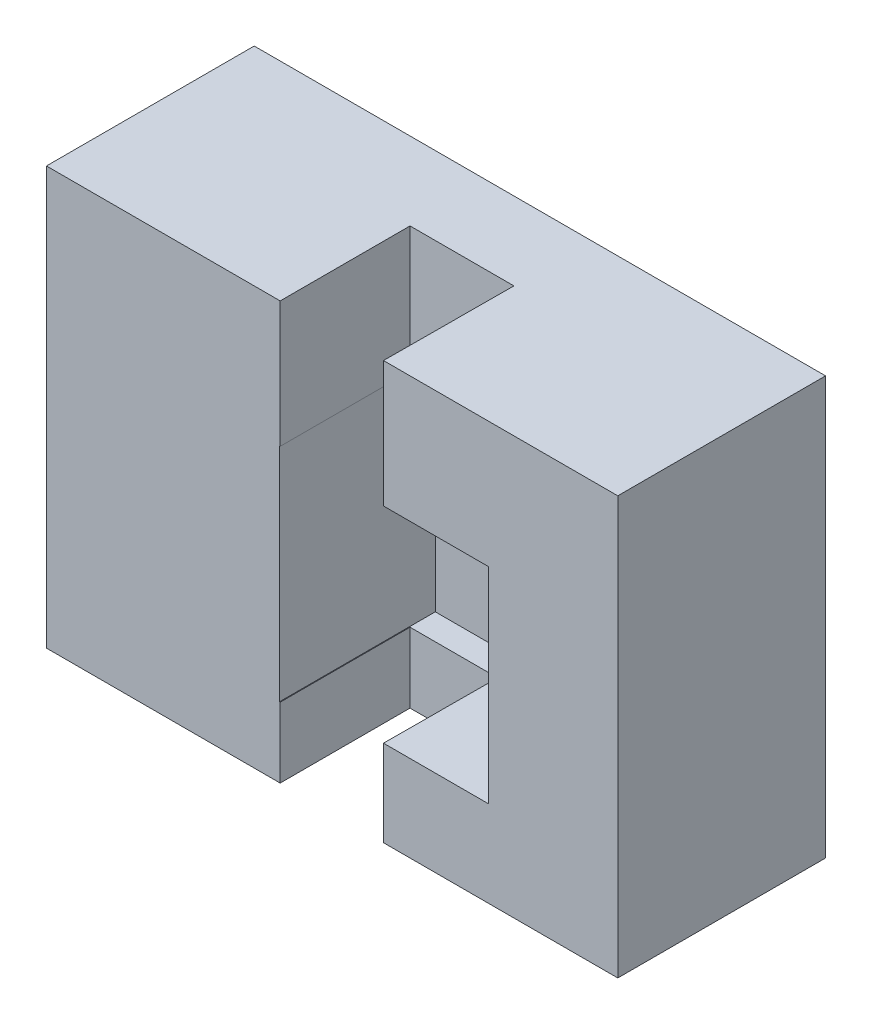
ISO-10303-21;
HEADER;
FILE_DESCRIPTION(('STEP AP214'),'2;1');
FILE_NAME('part.step','',(''),(''),'','','');
FILE_SCHEMA(('AUTOMOTIVE_DESIGN { 1 0 10303 214 1 1 1 1 }'));
ENDSEC;
DATA;
#1=APPLICATION_CONTEXT('core data for automotive mechanical design processes');
#2=APPLICATION_PROTOCOL_DEFINITION('international standard','automotive_design',2000,#1);
#3=PRODUCT_CONTEXT('',#1,'mechanical');
#4=PRODUCT('Part','Part','',(#3));
#5=PRODUCT_RELATED_PRODUCT_CATEGORY('part','',(#4));
#6=PRODUCT_DEFINITION_FORMATION('','',#4);
#7=PRODUCT_DEFINITION_CONTEXT('part definition',#1,'design');
#8=PRODUCT_DEFINITION('design','',#6,#7);
#9=PRODUCT_DEFINITION_SHAPE('','',#8);
#10=(LENGTH_UNIT() NAMED_UNIT(*) SI_UNIT(.MILLI.,.METRE.));
#11=(NAMED_UNIT(*) PLANE_ANGLE_UNIT() SI_UNIT($,.RADIAN.));
#12=(NAMED_UNIT(*) SI_UNIT($,.STERADIAN.) SOLID_ANGLE_UNIT());
#13=UNCERTAINTY_MEASURE_WITH_UNIT(LENGTH_MEASURE(1.E-05),#10,'distance_accuracy_value','');
#14=(GEOMETRIC_REPRESENTATION_CONTEXT(3) GLOBAL_UNCERTAINTY_ASSIGNED_CONTEXT((#13)) GLOBAL_UNIT_ASSIGNED_CONTEXT((#10,
#11,#12)) REPRESENTATION_CONTEXT('',''));
#15=CARTESIAN_POINT('',(0.,0.,0.));
#16=DIRECTION('',(0.,0.,1.));
#17=DIRECTION('',(1.,0.,0.));
#18=AXIS2_PLACEMENT_3D('',#15,#16,#17);
#19=CARTESIAN_POINT('',(0.,0.,40.));
#20=DIRECTION('',(0.,0.,1.));
#21=DIRECTION('',(1.,0.,0.));
#22=AXIS2_PLACEMENT_3D('',#19,#20,#21);
#23=PLANE('',#22);
#24=DIRECTION('',(0.,1.,0.));
#25=VECTOR('',#24,1.);
#26=CARTESIAN_POINT('',(-9.99999999999963,-40.2,40.));
#27=LINE('',#26,#25);
#28=CARTESIAN_POINT('',(-9.99999999999963,15.947775895512,40.));
#29=VERTEX_POINT('',#28);
#30=CARTESIAN_POINT('',(-9.99999999999963,40.2,40.));
#31=VERTEX_POINT('',#30);
#32=EDGE_CURVE('E238',#29,#31,#27,.T.);
#33=ORIENTED_EDGE('',*,*,#32,.T.);
#34=DIRECTION('',(-1.,0.,0.));
#35=VECTOR('',#34,1.);
#36=CARTESIAN_POINT('',(-55.,40.2,40.));
#37=LINE('',#36,#35);
#38=CARTESIAN_POINT('',(-55.,40.2,40.));
#39=VERTEX_POINT('',#38);
#40=EDGE_CURVE('E196',#31,#39,#37,.T.);
#41=ORIENTED_EDGE('',*,*,#40,.T.);
#42=DIRECTION('',(0.,-1.,0.));
#43=VECTOR('',#42,1.);
#44=CARTESIAN_POINT('',(-55.,40.2,40.));
#45=LINE('',#44,#43);
#46=CARTESIAN_POINT('',(-55.,-40.2,40.));
#47=VERTEX_POINT('',#46);
#48=EDGE_CURVE('E186',#39,#47,#45,.T.);
#49=ORIENTED_EDGE('',*,*,#48,.T.);
#50=DIRECTION('',(1.,0.,0.));
#51=VECTOR('',#50,1.);
#52=CARTESIAN_POINT('',(-55.,-40.2,40.));
#53=LINE('',#52,#51);
#54=CARTESIAN_POINT('',(-9.99999999999963,-40.2,40.));
#55=VERTEX_POINT('',#54);
#56=EDGE_CURVE('E185',#47,#55,#53,.T.);
#57=ORIENTED_EDGE('',*,*,#56,.T.);
#58=CARTESIAN_POINT('',(-9.99999999999963,-26.7104778254286,40.));
#59=VERTEX_POINT('',#58);
#60=EDGE_CURVE('E241',#55,#59,#27,.T.);
#61=ORIENTED_EDGE('',*,*,#60,.T.);
#62=DIRECTION('',(1.,0.,0.));
#63=VECTOR('',#62,1.);
#64=CARTESIAN_POINT('',(-10.1339162472556,-26.7104778254286,40.));
#65=LINE('',#64,#63);
#66=CARTESIAN_POINT('',(-10.1339162472556,-26.7104778254286,40.));
#67=VERTEX_POINT('',#66);
#68=EDGE_CURVE('E168',#67,#59,#65,.T.);
#69=ORIENTED_EDGE('',*,*,#68,.F.);
#70=DIRECTION('',(0.,-1.,0.));
#71=VECTOR('',#70,1.);
#72=CARTESIAN_POINT('',(-10.1339162472556,15.947775895512,40.));
#73=LINE('',#72,#71);
#74=CARTESIAN_POINT('',(-10.1339162472556,15.947775895512,40.));
#75=VERTEX_POINT('',#74);
#76=EDGE_CURVE('E282',#75,#67,#73,.T.);
#77=ORIENTED_EDGE('',*,*,#76,.F.);
#78=DIRECTION('',(-1.,0.,0.));
#79=VECTOR('',#78,1.);
#80=CARTESIAN_POINT('',(30.0976078726265,15.947775895512,40.));
#81=LINE('',#80,#79);
#82=EDGE_CURVE('E279',#29,#75,#81,.T.);
#83=ORIENTED_EDGE('',*,*,#82,.F.);
#84=EDGE_LOOP('',(#33,#41,#49,#57,#61,#69,#77,#83));
#85=FACE_BOUND('',#84,.T.);
#86=ADVANCED_FACE('F33',(#85),#23,.T.);
#87=CARTESIAN_POINT('',(-55.,40.2,40.));
#88=DIRECTION('',(1.,0.,0.));
#89=DIRECTION('',(0.,1.,0.));
#90=AXIS2_PLACEMENT_3D('',#87,#88,#89);
#91=PLANE('',#90);
#92=DIRECTION('',(0.,-1.,0.));
#93=VECTOR('',#92,1.);
#94=CARTESIAN_POINT('',(-55.,40.2,0.));
#95=LINE('',#94,#93);
#96=CARTESIAN_POINT('',(-55.,40.2,0.));
#97=VERTEX_POINT('',#96);
#98=CARTESIAN_POINT('',(-55.,-40.2,0.));
#99=VERTEX_POINT('',#98);
#100=EDGE_CURVE('E201',#97,#99,#95,.T.);
#101=ORIENTED_EDGE('',*,*,#100,.T.);
#102=DIRECTION('',(0.,0.,-1.));
#103=VECTOR('',#102,1.);
#104=CARTESIAN_POINT('',(-55.,-40.2,40.));
#105=LINE('',#104,#103);
#106=EDGE_CURVE('E216',#47,#99,#105,.T.);
#107=ORIENTED_EDGE('',*,*,#106,.F.);
#108=ORIENTED_EDGE('',*,*,#48,.F.);
#109=DIRECTION('',(0.,0.,-1.));
#110=VECTOR('',#109,1.);
#111=CARTESIAN_POINT('',(-55.,40.2,40.));
#112=LINE('',#111,#110);
#113=EDGE_CURVE('E200',#39,#97,#112,.T.);
#114=ORIENTED_EDGE('',*,*,#113,.T.);
#115=EDGE_LOOP('',(#101,#107,#108,#114));
#116=FACE_BOUND('',#115,.T.);
#117=ADVANCED_FACE('F35',(#116),#91,.F.);
#118=CARTESIAN_POINT('',(-55.,-40.2,40.));
#119=DIRECTION('',(0.,1.,0.));
#120=DIRECTION('',(0.,0.,1.));
#121=AXIS2_PLACEMENT_3D('',#118,#119,#120);
#122=PLANE('',#121);
#123=DIRECTION('',(-1.,0.,0.));
#124=VECTOR('',#123,1.);
#125=CARTESIAN_POINT('',(10.0000000000004,-40.2,15.0000000000003));
#126=LINE('',#125,#124);
#127=CARTESIAN_POINT('',(10.0000000000004,-40.2,15.0000000000003));
#128=VERTEX_POINT('',#127);
#129=CARTESIAN_POINT('',(-9.99999999999962,-40.2,15.0000000000003));
#130=VERTEX_POINT('',#129);
#131=EDGE_CURVE('E178',#128,#130,#126,.T.);
#132=ORIENTED_EDGE('',*,*,#131,.T.);
#133=DIRECTION('',(0.,0.,1.));
#134=VECTOR('',#133,1.);
#135=CARTESIAN_POINT('',(-9.99999999999962,-40.2,15.0000000000003));
#136=LINE('',#135,#134);
#137=EDGE_CURVE('E246',#130,#55,#136,.T.);
#138=ORIENTED_EDGE('',*,*,#137,.T.);
#139=ORIENTED_EDGE('',*,*,#56,.F.);
#140=ORIENTED_EDGE('',*,*,#106,.T.);
#141=DIRECTION('',(1.,0.,0.));
#142=VECTOR('',#141,1.);
#143=CARTESIAN_POINT('',(-55.,-40.2,0.));
#144=LINE('',#143,#142);
#145=CARTESIAN_POINT('',(55.,-40.2,0.));
#146=VERTEX_POINT('',#145);
#147=EDGE_CURVE('E204',#99,#146,#144,.T.);
#148=ORIENTED_EDGE('',*,*,#147,.T.);
#149=DIRECTION('',(0.,0.,-1.));
#150=VECTOR('',#149,1.);
#151=CARTESIAN_POINT('',(55.,-40.2,40.));
#152=LINE('',#151,#150);
#153=CARTESIAN_POINT('',(55.,-40.2,40.));
#154=VERTEX_POINT('',#153);
#155=EDGE_CURVE('E183',#154,#146,#152,.T.);
#156=ORIENTED_EDGE('',*,*,#155,.F.);
#157=CARTESIAN_POINT('',(9.88902334372366,-40.2,40.));
#158=VERTEX_POINT('',#157);
#159=EDGE_CURVE('E161',#158,#154,#53,.T.);
#160=ORIENTED_EDGE('',*,*,#159,.F.);
#161=DIRECTION('',(0.00443902251512886,0.,-0.999990147491019));
#162=VECTOR('',#161,1.);
#163=CARTESIAN_POINT('',(9.88902334372366,-40.2,40.));
#164=LINE('',#163,#162);
#165=EDGE_CURVE('E171',#158,#128,#164,.T.);
#166=ORIENTED_EDGE('',*,*,#165,.T.);
#167=EDGE_LOOP('',(#132,#138,#139,#140,#148,#156,#160,#166));
#168=FACE_BOUND('',#167,.T.);
#169=ADVANCED_FACE('F181',(#168),#122,.F.);
#170=CARTESIAN_POINT('',(55.,40.2,40.));
#171=DIRECTION('',(-1.,0.,0.));
#172=DIRECTION('',(0.,0.,1.));
#173=AXIS2_PLACEMENT_3D('',#170,#171,#172);
#174=PLANE('',#173);
#175=DIRECTION('',(0.,1.,0.));
#176=VECTOR('',#175,1.);
#177=CARTESIAN_POINT('',(55.,40.2,0.));
#178=LINE('',#177,#176);
#179=CARTESIAN_POINT('',(55.,40.2,0.));
#180=VERTEX_POINT('',#179);
#181=EDGE_CURVE('E207',#146,#180,#178,.T.);
#182=ORIENTED_EDGE('',*,*,#181,.T.);
#183=DIRECTION('',(0.,0.,-1.));
#184=VECTOR('',#183,1.);
#185=CARTESIAN_POINT('',(55.,40.2,40.));
#186=LINE('',#185,#184);
#187=CARTESIAN_POINT('',(55.,40.2,40.));
#188=VERTEX_POINT('',#187);
#189=EDGE_CURVE('E212',#188,#180,#186,.T.);
#190=ORIENTED_EDGE('',*,*,#189,.F.);
#191=DIRECTION('',(0.,1.,0.));
#192=VECTOR('',#191,1.);
#193=CARTESIAN_POINT('',(55.,40.2,40.));
#194=LINE('',#193,#192);
#195=EDGE_CURVE('E189',#154,#188,#194,.T.);
#196=ORIENTED_EDGE('',*,*,#195,.F.);
#197=ORIENTED_EDGE('',*,*,#155,.T.);
#198=EDGE_LOOP('',(#182,#190,#196,#197));
#199=FACE_BOUND('',#198,.T.);
#200=ADVANCED_FACE('F372',(#199),#174,.F.);
#201=CARTESIAN_POINT('',(-55.,40.2,40.));
#202=DIRECTION('',(0.,-1.,0.));
#203=DIRECTION('',(0.,0.,-1.));
#204=AXIS2_PLACEMENT_3D('',#201,#202,#203);
#205=PLANE('',#204);
#206=ORIENTED_EDGE('',*,*,#40,.F.);
#207=DIRECTION('',(0.,0.,1.));
#208=VECTOR('',#207,1.);
#209=CARTESIAN_POINT('',(-9.99999999999962,40.2,15.0000000000003));
#210=LINE('',#209,#208);
#211=CARTESIAN_POINT('',(-9.99999999999962,40.2,15.0000000000003));
#212=VERTEX_POINT('',#211);
#213=EDGE_CURVE('E179',#212,#31,#210,.T.);
#214=ORIENTED_EDGE('',*,*,#213,.F.);
#215=DIRECTION('',(-1.,0.,0.));
#216=VECTOR('',#215,1.);
#217=CARTESIAN_POINT('',(10.0000000000004,40.2,15.0000000000003));
#218=LINE('',#217,#216);
#219=CARTESIAN_POINT('',(10.0000000000004,40.2,15.0000000000003));
#220=VERTEX_POINT('',#219);
#221=EDGE_CURVE('E232',#220,#212,#218,.T.);
#222=ORIENTED_EDGE('',*,*,#221,.F.);
#223=DIRECTION('',(0.00443902251512886,0.,-0.999990147491019));
#224=VECTOR('',#223,1.);
#225=CARTESIAN_POINT('',(9.88902334372366,40.2,40.));
#226=LINE('',#225,#224);
#227=CARTESIAN_POINT('',(9.88902334372366,40.2,40.));
#228=VERTEX_POINT('',#227);
#229=EDGE_CURVE('E308',#228,#220,#226,.T.);
#230=ORIENTED_EDGE('',*,*,#229,.F.);
#231=EDGE_CURVE('E197',#188,#228,#37,.T.);
#232=ORIENTED_EDGE('',*,*,#231,.F.);
#233=ORIENTED_EDGE('',*,*,#189,.T.);
#234=DIRECTION('',(-1.,0.,0.));
#235=VECTOR('',#234,1.);
#236=CARTESIAN_POINT('',(-55.,40.2,0.));
#237=LINE('',#236,#235);
#238=EDGE_CURVE('E191',#180,#97,#237,.T.);
#239=ORIENTED_EDGE('',*,*,#238,.T.);
#240=ORIENTED_EDGE('',*,*,#113,.F.);
#241=EDGE_LOOP('',(#206,#214,#222,#230,#232,#233,#239,#240));
#242=FACE_BOUND('',#241,.T.);
#243=ADVANCED_FACE('F311',(#242),#205,.F.);
#244=DIRECTION('',(0.,1.,0.));
#245=VECTOR('',#244,1.);
#246=CARTESIAN_POINT('',(9.88902334372366,-26.7104778254286,40.));
#247=LINE('',#246,#245);
#248=CARTESIAN_POINT('',(9.88902334372366,-23.5994291863939,40.));
#249=VERTEX_POINT('',#248);
#250=EDGE_CURVE('E157',#158,#249,#247,.T.);
#251=ORIENTED_EDGE('',*,*,#250,.F.);
#252=ORIENTED_EDGE('',*,*,#159,.T.);
#253=ORIENTED_EDGE('',*,*,#195,.T.);
#254=ORIENTED_EDGE('',*,*,#231,.T.);
#255=DIRECTION('',(0.,1.,0.));
#256=VECTOR('',#255,1.);
#257=CARTESIAN_POINT('',(9.88902334372366,-40.2,40.));
#258=LINE('',#257,#256);
#259=CARTESIAN_POINT('',(9.88902334372366,15.947775895512,40.));
#260=VERTEX_POINT('',#259);
#261=EDGE_CURVE('E244',#260,#228,#258,.T.);
#262=ORIENTED_EDGE('',*,*,#261,.F.);
#263=CARTESIAN_POINT('',(30.0976078726265,15.947775895512,40.));
#264=VERTEX_POINT('',#263);
#265=EDGE_CURVE('E280',#264,#260,#81,.T.);
#266=ORIENTED_EDGE('',*,*,#265,.F.);
#267=DIRECTION('',(0.,1.,0.));
#268=VECTOR('',#267,1.);
#269=CARTESIAN_POINT('',(30.0976078726265,-23.5994291863939,40.));
#270=LINE('',#269,#268);
#271=CARTESIAN_POINT('',(30.0976078726265,-23.5994291863939,40.));
#272=VERTEX_POINT('',#271);
#273=EDGE_CURVE('E258',#272,#264,#270,.T.);
#274=ORIENTED_EDGE('',*,*,#273,.F.);
#275=DIRECTION('',(1.,0.,0.));
#276=VECTOR('',#275,1.);
#277=CARTESIAN_POINT('',(9.88902334372366,-23.5994291863939,40.));
#278=LINE('',#277,#276);
#279=EDGE_CURVE('E165',#249,#272,#278,.T.);
#280=ORIENTED_EDGE('',*,*,#279,.F.);
#281=EDGE_LOOP('',(#251,#252,#253,#254,#262,#266,#274,#280));
#282=FACE_BOUND('',#281,.T.);
#283=ADVANCED_FACE('F159',(#282),#23,.T.);
#284=CARTESIAN_POINT('',(0.,0.,0.));
#285=DIRECTION('',(0.,0.,1.));
#286=DIRECTION('',(1.,0.,0.));
#287=AXIS2_PLACEMENT_3D('',#284,#285,#286);
#288=PLANE('',#287);
#289=ORIENTED_EDGE('',*,*,#100,.F.);
#290=ORIENTED_EDGE('',*,*,#238,.F.);
#291=ORIENTED_EDGE('',*,*,#181,.F.);
#292=ORIENTED_EDGE('',*,*,#147,.F.);
#293=EDGE_LOOP('',(#289,#290,#291,#292));
#294=FACE_BOUND('',#293,.T.);
#295=ADVANCED_FACE('F366',(#294),#288,.F.);
#296=CARTESIAN_POINT('',(30.0976078726265,-23.5994291863939,10.));
#297=DIRECTION('',(1.,0.,0.));
#298=DIRECTION('',(0.,0.,-1.));
#299=AXIS2_PLACEMENT_3D('',#296,#297,#298);
#300=PLANE('',#299);
#301=ORIENTED_EDGE('',*,*,#273,.T.);
#302=DIRECTION('',(0.,0.,1.));
#303=VECTOR('',#302,1.);
#304=CARTESIAN_POINT('',(30.0976078726265,15.947775895512,10.));
#305=LINE('',#304,#303);
#306=CARTESIAN_POINT('',(30.0976078726265,15.947775895512,10.));
#307=VERTEX_POINT('',#306);
#308=EDGE_CURVE('E277',#307,#264,#305,.T.);
#309=ORIENTED_EDGE('',*,*,#308,.F.);
#310=DIRECTION('',(0.,1.,0.));
#311=VECTOR('',#310,1.);
#312=CARTESIAN_POINT('',(30.0976078726265,-23.5994291863939,10.));
#313=LINE('',#312,#311);
#314=CARTESIAN_POINT('',(30.0976078726265,-23.5994291863939,10.));
#315=VERTEX_POINT('',#314);
#316=EDGE_CURVE('E259',#315,#307,#313,.T.);
#317=ORIENTED_EDGE('',*,*,#316,.F.);
#318=DIRECTION('',(0.,0.,1.));
#319=VECTOR('',#318,1.);
#320=CARTESIAN_POINT('',(30.0976078726265,-23.5994291863939,10.));
#321=LINE('',#320,#319);
#322=EDGE_CURVE('E205',#315,#272,#321,.T.);
#323=ORIENTED_EDGE('',*,*,#322,.T.);
#324=EDGE_LOOP('',(#301,#309,#317,#323));
#325=FACE_BOUND('',#324,.T.);
#326=ADVANCED_FACE('F341',(#325),#300,.F.);
#327=CARTESIAN_POINT('',(9.88902334372366,-23.5994291863939,10.));
#328=DIRECTION('',(0.,-1.,0.));
#329=DIRECTION('',(0.,0.,-1.));
#330=AXIS2_PLACEMENT_3D('',#327,#328,#329);
#331=PLANE('',#330);
#332=DIRECTION('',(0.,0.,1.));
#333=VECTOR('',#332,1.);
#334=CARTESIAN_POINT('',(9.88902334372366,-23.5994291863939,10.));
#335=LINE('',#334,#333);
#336=CARTESIAN_POINT('',(9.88902334372366,-23.5994291863939,10.));
#337=VERTEX_POINT('',#336);
#338=CARTESIAN_POINT('',(9.88902334372366,-23.5994291863939,15.0000000000003));
#339=VERTEX_POINT('',#338);
#340=EDGE_CURVE('E289',#337,#339,#335,.T.);
#341=ORIENTED_EDGE('',*,*,#340,.T.);
#342=DIRECTION('',(1.,0.,0.));
#343=VECTOR('',#342,1.);
#344=CARTESIAN_POINT('',(9.88902334372366,-23.5994291863939,15.0000000000003));
#345=LINE('',#344,#343);
#346=CARTESIAN_POINT('',(10.0000000000004,-23.5994291863939,15.0000000000003));
#347=VERTEX_POINT('',#346);
#348=EDGE_CURVE('E252',#339,#347,#345,.T.);
#349=ORIENTED_EDGE('',*,*,#348,.T.);
#350=DIRECTION('',(-0.00443902251512886,0.,0.999990147491019));
#351=VECTOR('',#350,1.);
#352=CARTESIAN_POINT('',(10.0221927071122,-23.5994291863939,10.0005911476267));
#353=LINE('',#352,#351);
#354=EDGE_CURVE('E247',#347,#249,#353,.T.);
#355=ORIENTED_EDGE('',*,*,#354,.T.);
#356=ORIENTED_EDGE('',*,*,#279,.T.);
#357=ORIENTED_EDGE('',*,*,#322,.F.);
#358=DIRECTION('',(1.,0.,0.));
#359=VECTOR('',#358,1.);
#360=CARTESIAN_POINT('',(9.88902334372366,-23.5994291863939,10.));
#361=LINE('',#360,#359);
#362=EDGE_CURVE('E274',#337,#315,#361,.T.);
#363=ORIENTED_EDGE('',*,*,#362,.F.);
#364=EDGE_LOOP('',(#341,#349,#355,#356,#357,#363));
#365=FACE_BOUND('',#364,.T.);
#366=ADVANCED_FACE('F343',(#365),#331,.F.);
#367=CARTESIAN_POINT('',(9.88902334372366,-26.7104778254286,10.));
#368=DIRECTION('',(1.,0.,0.));
#369=DIRECTION('',(0.,0.,-1.));
#370=AXIS2_PLACEMENT_3D('',#367,#368,#369);
#371=PLANE('',#370);
#372=DIRECTION('',(0.,0.,1.));
#373=VECTOR('',#372,1.);
#374=CARTESIAN_POINT('',(9.88902334372366,-26.7104778254286,10.));
#375=LINE('',#374,#373);
#376=CARTESIAN_POINT('',(9.88902334372366,-26.7104778254286,10.));
#377=VERTEX_POINT('',#376);
#378=CARTESIAN_POINT('',(9.88902334372366,-26.7104778254286,15.0000000000003));
#379=VERTEX_POINT('',#378);
#380=EDGE_CURVE('E292',#377,#379,#375,.T.);
#381=ORIENTED_EDGE('',*,*,#380,.T.);
#382=DIRECTION('',(0.,1.,0.));
#383=VECTOR('',#382,1.);
#384=CARTESIAN_POINT('',(9.88902334372366,-26.7104778254286,15.0000000000003));
#385=LINE('',#384,#383);
#386=EDGE_CURVE('E48',#379,#339,#385,.T.);
#387=ORIENTED_EDGE('',*,*,#386,.T.);
#388=ORIENTED_EDGE('',*,*,#340,.F.);
#389=DIRECTION('',(0.,1.,0.));
#390=VECTOR('',#389,1.);
#391=CARTESIAN_POINT('',(9.88902334372366,-26.7104778254286,10.));
#392=LINE('',#391,#390);
#393=EDGE_CURVE('E271',#377,#337,#392,.T.);
#394=ORIENTED_EDGE('',*,*,#393,.F.);
#395=EDGE_LOOP('',(#381,#387,#388,#394));
#396=FACE_BOUND('',#395,.T.);
#397=ADVANCED_FACE('F346',(#396),#371,.F.);
#398=CARTESIAN_POINT('',(-10.1339162472556,-26.7104778254286,10.));
#399=DIRECTION('',(0.,-1.,0.));
#400=DIRECTION('',(0.,0.,-1.));
#401=AXIS2_PLACEMENT_3D('',#398,#399,#400);
#402=PLANE('',#401);
#403=ORIENTED_EDGE('',*,*,#68,.T.);
#404=DIRECTION('',(0.,0.,-1.));
#405=VECTOR('',#404,1.);
#406=CARTESIAN_POINT('',(-9.99999999999962,-26.7104778254286,10.));
#407=LINE('',#406,#405);
#408=CARTESIAN_POINT('',(-9.99999999999962,-26.7104778254286,15.0000000000003));
#409=VERTEX_POINT('',#408);
#410=EDGE_CURVE('E255',#59,#409,#407,.T.);
#411=ORIENTED_EDGE('',*,*,#410,.T.);
#412=DIRECTION('',(1.,0.,0.));
#413=VECTOR('',#412,1.);
#414=CARTESIAN_POINT('',(-10.1339162472556,-26.7104778254286,15.0000000000003));
#415=LINE('',#414,#413);
#416=EDGE_CURVE('E249',#409,#379,#415,.T.);
#417=ORIENTED_EDGE('',*,*,#416,.T.);
#418=ORIENTED_EDGE('',*,*,#380,.F.);
#419=DIRECTION('',(1.,0.,0.));
#420=VECTOR('',#419,1.);
#421=CARTESIAN_POINT('',(-10.1339162472556,-26.7104778254286,10.));
#422=LINE('',#421,#420);
#423=CARTESIAN_POINT('',(-10.1339162472556,-26.7104778254286,10.));
#424=VERTEX_POINT('',#423);
#425=EDGE_CURVE('E268',#424,#377,#422,.T.);
#426=ORIENTED_EDGE('',*,*,#425,.F.);
#427=DIRECTION('',(0.,0.,1.));
#428=VECTOR('',#427,1.);
#429=CARTESIAN_POINT('',(-10.1339162472556,-26.7104778254286,10.));
#430=LINE('',#429,#428);
#431=EDGE_CURVE('E295',#424,#67,#430,.T.);
#432=ORIENTED_EDGE('',*,*,#431,.T.);
#433=EDGE_LOOP('',(#403,#411,#417,#418,#426,#432));
#434=FACE_BOUND('',#433,.T.);
#435=ADVANCED_FACE('F333',(#434),#402,.F.);
#436=CARTESIAN_POINT('',(-10.1339162472556,15.947775895512,10.));
#437=DIRECTION('',(-1.,0.,0.));
#438=DIRECTION('',(0.,0.,1.));
#439=AXIS2_PLACEMENT_3D('',#436,#437,#438);
#440=PLANE('',#439);
#441=ORIENTED_EDGE('',*,*,#76,.T.);
#442=ORIENTED_EDGE('',*,*,#431,.F.);
#443=DIRECTION('',(0.,-1.,0.));
#444=VECTOR('',#443,1.);
#445=CARTESIAN_POINT('',(-10.1339162472556,15.947775895512,10.));
#446=LINE('',#445,#444);
#447=CARTESIAN_POINT('',(-10.1339162472556,15.947775895512,10.));
#448=VERTEX_POINT('',#447);
#449=EDGE_CURVE('E265',#448,#424,#446,.T.);
#450=ORIENTED_EDGE('',*,*,#449,.F.);
#451=DIRECTION('',(0.,0.,1.));
#452=VECTOR('',#451,1.);
#453=CARTESIAN_POINT('',(-10.1339162472556,15.947775895512,10.));
#454=LINE('',#453,#452);
#455=EDGE_CURVE('E297',#448,#75,#454,.T.);
#456=ORIENTED_EDGE('',*,*,#455,.T.);
#457=EDGE_LOOP('',(#441,#442,#450,#456));
#458=FACE_BOUND('',#457,.T.);
#459=ADVANCED_FACE('F336',(#458),#440,.F.);
#460=CARTESIAN_POINT('',(30.0976078726265,15.947775895512,10.));
#461=DIRECTION('',(0.,1.,0.));
#462=DIRECTION('',(0.,0.,1.));
#463=AXIS2_PLACEMENT_3D('',#460,#461,#462);
#464=PLANE('',#463);
#465=DIRECTION('',(-1.,0.,0.));
#466=VECTOR('',#465,1.);
#467=CARTESIAN_POINT('',(30.0976078726265,15.947775895512,15.0000000000003));
#468=LINE('',#467,#466);
#469=CARTESIAN_POINT('',(10.0000000000004,15.947775895512,15.0000000000003));
#470=VERTEX_POINT('',#469);
#471=CARTESIAN_POINT('',(-9.99999999999962,15.947775895512,15.0000000000003));
#472=VERTEX_POINT('',#471);
#473=EDGE_CURVE('E41',#470,#472,#468,.T.);
#474=ORIENTED_EDGE('',*,*,#473,.T.);
#475=DIRECTION('',(0.,0.,1.));
#476=VECTOR('',#475,1.);
#477=CARTESIAN_POINT('',(-9.99999999999962,15.947775895512,9.99999999999999));
#478=LINE('',#477,#476);
#479=EDGE_CURVE('E11',#472,#29,#478,.T.);
#480=ORIENTED_EDGE('',*,*,#479,.T.);
#481=ORIENTED_EDGE('',*,*,#82,.T.);
#482=ORIENTED_EDGE('',*,*,#455,.F.);
#483=DIRECTION('',(-1.,0.,0.));
#484=VECTOR('',#483,1.);
#485=CARTESIAN_POINT('',(30.0976078726265,15.947775895512,10.));
#486=LINE('',#485,#484);
#487=EDGE_CURVE('E262',#307,#448,#486,.T.);
#488=ORIENTED_EDGE('',*,*,#487,.F.);
#489=ORIENTED_EDGE('',*,*,#308,.T.);
#490=ORIENTED_EDGE('',*,*,#265,.T.);
#491=DIRECTION('',(0.00443902251512886,0.,-0.999990147491019));
#492=VECTOR('',#491,1.);
#493=CARTESIAN_POINT('',(10.0225909156717,15.947775895512,9.91088566973675));
#494=LINE('',#493,#492);
#495=EDGE_CURVE('E219',#260,#470,#494,.T.);
#496=ORIENTED_EDGE('',*,*,#495,.T.);
#497=EDGE_LOOP('',(#474,#480,#481,#482,#488,#489,#490,#496));
#498=FACE_BOUND('',#497,.T.);
#499=ADVANCED_FACE('F223',(#498),#464,.F.);
#500=CARTESIAN_POINT('',(0.,0.,10.));
#501=DIRECTION('',(0.,0.,1.));
#502=DIRECTION('',(1.,0.,0.));
#503=AXIS2_PLACEMENT_3D('',#500,#501,#502);
#504=PLANE('',#503);
#505=ORIENTED_EDGE('',*,*,#316,.T.);
#506=ORIENTED_EDGE('',*,*,#487,.T.);
#507=ORIENTED_EDGE('',*,*,#449,.T.);
#508=ORIENTED_EDGE('',*,*,#425,.T.);
#509=ORIENTED_EDGE('',*,*,#393,.T.);
#510=ORIENTED_EDGE('',*,*,#362,.T.);
#511=EDGE_LOOP('',(#505,#506,#507,#508,#509,#510));
#512=FACE_BOUND('',#511,.T.);
#513=ADVANCED_FACE('F339',(#512),#504,.T.);
#514=CARTESIAN_POINT('',(9.88902334372366,-40.2,40.));
#515=DIRECTION('',(0.999990147491019,0.,0.00443902251512886));
#516=DIRECTION('',(0.00443902251512886,0.,-0.999990147491019));
#517=AXIS2_PLACEMENT_3D('',#514,#515,#516);
#518=PLANE('',#517);
#519=ORIENTED_EDGE('',*,*,#261,.T.);
#520=ORIENTED_EDGE('',*,*,#229,.T.);
#521=DIRECTION('',(0.,1.,0.));
#522=VECTOR('',#521,1.);
#523=CARTESIAN_POINT('',(10.0000000000004,-40.2,15.0000000000003));
#524=LINE('',#523,#522);
#525=EDGE_CURVE('E56',#470,#220,#524,.T.);
#526=ORIENTED_EDGE('',*,*,#525,.F.);
#527=ORIENTED_EDGE('',*,*,#495,.F.);
#528=EDGE_LOOP('',(#519,#520,#526,#527));
#529=FACE_BOUND('',#528,.T.);
#530=ADVANCED_FACE('F307',(#529),#518,.F.);
#531=CARTESIAN_POINT('',(10.0000000000004,-40.2,15.0000000000003));
#532=DIRECTION('',(0.,0.,-1.));
#533=DIRECTION('',(-1.,0.,0.));
#534=AXIS2_PLACEMENT_3D('',#531,#532,#533);
#535=PLANE('',#534);
#536=ORIENTED_EDGE('',*,*,#525,.T.);
#537=ORIENTED_EDGE('',*,*,#221,.T.);
#538=DIRECTION('',(0.,1.,0.));
#539=VECTOR('',#538,1.);
#540=CARTESIAN_POINT('',(-9.99999999999962,-40.2,15.0000000000003));
#541=LINE('',#540,#539);
#542=EDGE_CURVE('E230',#472,#212,#541,.T.);
#543=ORIENTED_EDGE('',*,*,#542,.F.);
#544=ORIENTED_EDGE('',*,*,#473,.F.);
#545=EDGE_LOOP('',(#536,#537,#543,#544));
#546=FACE_BOUND('',#545,.T.);
#547=ADVANCED_FACE('F228',(#546),#535,.F.);
#548=CARTESIAN_POINT('',(-9.99999999999962,-40.2,15.0000000000003));
#549=DIRECTION('',(-1.,0.,0.));
#550=DIRECTION('',(0.,0.,1.));
#551=AXIS2_PLACEMENT_3D('',#548,#549,#550);
#552=PLANE('',#551);
#553=ORIENTED_EDGE('',*,*,#542,.T.);
#554=ORIENTED_EDGE('',*,*,#213,.T.);
#555=ORIENTED_EDGE('',*,*,#32,.F.);
#556=ORIENTED_EDGE('',*,*,#479,.F.);
#557=EDGE_LOOP('',(#553,#554,#555,#556));
#558=FACE_BOUND('',#557,.T.);
#559=ADVANCED_FACE('F317',(#558),#552,.F.);
#560=ORIENTED_EDGE('',*,*,#60,.F.);
#561=ORIENTED_EDGE('',*,*,#137,.F.);
#562=EDGE_CURVE('E235',#130,#409,#541,.T.);
#563=ORIENTED_EDGE('',*,*,#562,.T.);
#564=ORIENTED_EDGE('',*,*,#410,.F.);
#565=EDGE_LOOP('',(#560,#561,#563,#564));
#566=FACE_BOUND('',#565,.T.);
#567=ADVANCED_FACE('F331',(#566),#552,.F.);
#568=ORIENTED_EDGE('',*,*,#386,.F.);
#569=ORIENTED_EDGE('',*,*,#416,.F.);
#570=ORIENTED_EDGE('',*,*,#562,.F.);
#571=ORIENTED_EDGE('',*,*,#131,.F.);
#572=EDGE_CURVE('E174',#128,#347,#524,.T.);
#573=ORIENTED_EDGE('',*,*,#572,.T.);
#574=ORIENTED_EDGE('',*,*,#348,.F.);
#575=EDGE_LOOP('',(#568,#569,#570,#571,#573,#574));
#576=FACE_BOUND('',#575,.T.);
#577=ADVANCED_FACE('F344',(#576),#535,.F.);
#578=ORIENTED_EDGE('',*,*,#572,.F.);
#579=ORIENTED_EDGE('',*,*,#165,.F.);
#580=ORIENTED_EDGE('',*,*,#250,.T.);
#581=ORIENTED_EDGE('',*,*,#354,.F.);
#582=EDGE_LOOP('',(#578,#579,#580,#581));
#583=FACE_BOUND('',#582,.T.);
#584=ADVANCED_FACE('F172',(#583),#518,.F.);
#585=CLOSED_SHELL('',(#86,#117,#169,#200,#243,#283,#295,#326,#366,#397,#435,#459,#499,#513,#530,
#547,#559,#567,#577,#584));
#586=MANIFOLD_SOLID_BREP('B2',#585);
#587=ADVANCED_BREP_SHAPE_REPRESENTATION('',(#18,#586),#14);
#588=SHAPE_DEFINITION_REPRESENTATION(#9,#587);
ENDSEC;
END-ISO-10303-21;
